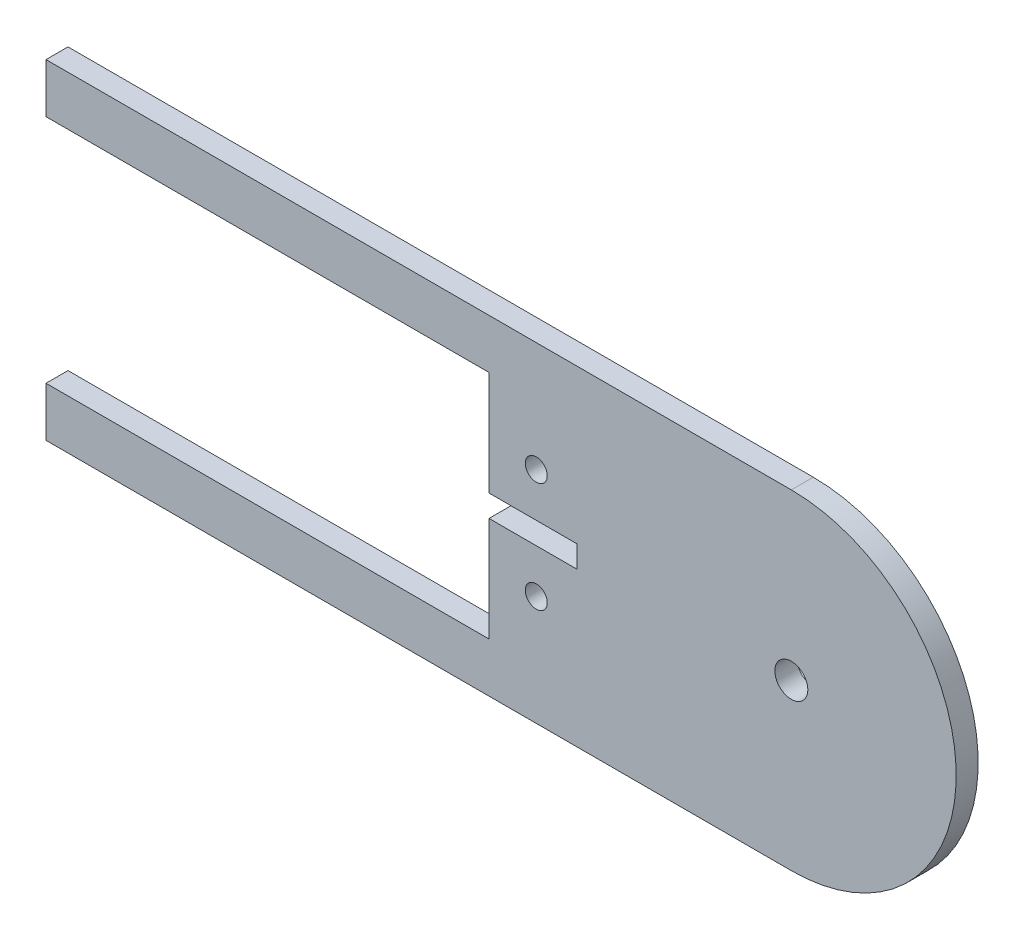
ISO-10303-21;
HEADER;
FILE_DESCRIPTION(('STEP AP214'),'2;1');
FILE_NAME('part.step','',(''),(''),'','','');
FILE_SCHEMA(('AUTOMOTIVE_DESIGN { 1 0 10303 214 1 1 1 1 }'));
ENDSEC;
DATA;
#1=APPLICATION_CONTEXT('core data for automotive mechanical design processes');
#2=APPLICATION_PROTOCOL_DEFINITION('international standard','automotive_design',2000,#1);
#3=PRODUCT_CONTEXT('',#1,'mechanical');
#4=PRODUCT('Part','Part','',(#3));
#5=PRODUCT_RELATED_PRODUCT_CATEGORY('part','',(#4));
#6=PRODUCT_DEFINITION_FORMATION('','',#4);
#7=PRODUCT_DEFINITION_CONTEXT('part definition',#1,'design');
#8=PRODUCT_DEFINITION('design','',#6,#7);
#9=PRODUCT_DEFINITION_SHAPE('','',#8);
#10=(LENGTH_UNIT() NAMED_UNIT(*) SI_UNIT(.MILLI.,.METRE.));
#11=(NAMED_UNIT(*) PLANE_ANGLE_UNIT() SI_UNIT($,.RADIAN.));
#12=(NAMED_UNIT(*) SI_UNIT($,.STERADIAN.) SOLID_ANGLE_UNIT());
#13=UNCERTAINTY_MEASURE_WITH_UNIT(LENGTH_MEASURE(1.E-05),#10,'distance_accuracy_value','');
#14=(GEOMETRIC_REPRESENTATION_CONTEXT(3) GLOBAL_UNCERTAINTY_ASSIGNED_CONTEXT((#13)) GLOBAL_UNIT_ASSIGNED_CONTEXT((#10,
#11,#12)) REPRESENTATION_CONTEXT('',''));
#15=CARTESIAN_POINT('',(0.,0.,0.));
#16=DIRECTION('',(0.,0.,1.));
#17=DIRECTION('',(1.,0.,0.));
#18=AXIS2_PLACEMENT_3D('',#15,#16,#17);
#19=CARTESIAN_POINT('',(0.,30.,-33.));
#20=DIRECTION('',(0.,0.,1.));
#21=DIRECTION('',(1.,0.,0.));
#22=AXIS2_PLACEMENT_3D('',#19,#20,#21);
#23=PLANE('',#22);
#24=CARTESIAN_POINT('',(77.8,15.,-33.));
#25=DIRECTION('',(0.,0.,1.));
#26=DIRECTION('',(1.,0.,0.));
#27=AXIS2_PLACEMENT_3D('',#24,#25,#26);
#28=CIRCLE('',#27,1.5);
#29=CARTESIAN_POINT('',(79.3,15.,-33.));
#30=VERTEX_POINT('',#29);
#31=EDGE_CURVE('E181',#30,#30,#28,.T.);
#32=ORIENTED_EDGE('',*,*,#31,.T.);
#33=EDGE_LOOP('',(#32));
#34=FACE_BOUND('',#33,.T.);
#35=CARTESIAN_POINT('',(54.6,9.99999999999999,-33.));
#36=DIRECTION('',(0.,0.,-1.));
#37=DIRECTION('',(-1.,0.,0.));
#38=AXIS2_PLACEMENT_3D('',#35,#36,#37);
#39=CIRCLE('',#38,1.00000000000001);
#40=CARTESIAN_POINT('',(53.6,9.99999999999999,-33.));
#41=VERTEX_POINT('',#40);
#42=EDGE_CURVE('E176',#41,#41,#39,.T.);
#43=ORIENTED_EDGE('',*,*,#42,.F.);
#44=EDGE_LOOP('',(#43));
#45=FACE_BOUND('',#44,.T.);
#46=CARTESIAN_POINT('',(54.6,20.,-33.));
#47=DIRECTION('',(0.,0.,-1.));
#48=DIRECTION('',(-1.,0.,0.));
#49=AXIS2_PLACEMENT_3D('',#46,#47,#48);
#50=CIRCLE('',#49,0.999999999999998);
#51=CARTESIAN_POINT('',(53.6,20.,-33.));
#52=VERTEX_POINT('',#51);
#53=EDGE_CURVE('E255',#52,#52,#50,.T.);
#54=ORIENTED_EDGE('',*,*,#53,.F.);
#55=EDGE_LOOP('',(#54));
#56=FACE_BOUND('',#55,.T.);
#57=DIRECTION('',(-1.,0.,0.));
#58=VECTOR('',#57,1.);
#59=CARTESIAN_POINT('',(0.,30.,-33.));
#60=LINE('',#59,#58);
#61=CARTESIAN_POINT('',(77.8,30.,-33.));
#62=VERTEX_POINT('',#61);
#63=CARTESIAN_POINT('',(9.99999999999999,30.,-33.));
#64=VERTEX_POINT('',#63);
#65=EDGE_CURVE('E148',#62,#64,#60,.T.);
#66=ORIENTED_EDGE('',*,*,#65,.F.);
#67=CARTESIAN_POINT('',(77.8,15.,-33.));
#68=DIRECTION('',(0.,0.,1.));
#69=DIRECTION('',(-1.,0.,0.));
#70=AXIS2_PLACEMENT_3D('',#67,#68,#69);
#71=CIRCLE('',#70,15.);
#72=CARTESIAN_POINT('',(77.8,0.,-33.));
#73=VERTEX_POINT('',#72);
#74=EDGE_CURVE('E128',#73,#62,#71,.T.);
#75=ORIENTED_EDGE('',*,*,#74,.F.);
#76=DIRECTION('',(-1.,0.,0.));
#77=VECTOR('',#76,1.);
#78=CARTESIAN_POINT('',(0.,0.,-33.));
#79=LINE('',#78,#77);
#80=CARTESIAN_POINT('',(9.99999999999999,0.,-33.));
#81=VERTEX_POINT('',#80);
#82=EDGE_CURVE('E155',#73,#81,#79,.T.);
#83=ORIENTED_EDGE('',*,*,#82,.T.);
#84=DIRECTION('',(0.,-1.,0.));
#85=VECTOR('',#84,1.);
#86=CARTESIAN_POINT('',(9.99999999999999,30.,-33.));
#87=LINE('',#86,#85);
#88=CARTESIAN_POINT('',(10.,4.5,-33.));
#89=VERTEX_POINT('',#88);
#90=EDGE_CURVE('E46',#89,#81,#87,.T.);
#91=ORIENTED_EDGE('',*,*,#90,.F.);
#92=DIRECTION('',(1.,0.,0.));
#93=VECTOR('',#92,1.);
#94=CARTESIAN_POINT('',(0.,4.5,-33.));
#95=LINE('',#94,#93);
#96=CARTESIAN_POINT('',(50.3,4.5,-33.));
#97=VERTEX_POINT('',#96);
#98=EDGE_CURVE('E157',#89,#97,#95,.T.);
#99=ORIENTED_EDGE('',*,*,#98,.T.);
#100=DIRECTION('',(0.,1.,0.));
#101=VECTOR('',#100,1.);
#102=CARTESIAN_POINT('',(50.3,30.,-33.));
#103=LINE('',#102,#101);
#104=CARTESIAN_POINT('',(50.3,14.,-33.));
#105=VERTEX_POINT('',#104);
#106=EDGE_CURVE('E202',#97,#105,#103,.T.);
#107=ORIENTED_EDGE('',*,*,#106,.T.);
#108=DIRECTION('',(1.,0.,0.));
#109=VECTOR('',#108,1.);
#110=CARTESIAN_POINT('',(0.,14.,-33.));
#111=LINE('',#110,#109);
#112=CARTESIAN_POINT('',(58.3,14.,-33.));
#113=VERTEX_POINT('',#112);
#114=EDGE_CURVE('E225',#105,#113,#111,.T.);
#115=ORIENTED_EDGE('',*,*,#114,.T.);
#116=DIRECTION('',(0.,1.,0.));
#117=VECTOR('',#116,1.);
#118=CARTESIAN_POINT('',(58.3,30.,-33.));
#119=LINE('',#118,#117);
#120=CARTESIAN_POINT('',(58.3,16.,-33.));
#121=VERTEX_POINT('',#120);
#122=EDGE_CURVE('E228',#113,#121,#119,.T.);
#123=ORIENTED_EDGE('',*,*,#122,.T.);
#124=DIRECTION('',(-1.,0.,0.));
#125=VECTOR('',#124,1.);
#126=CARTESIAN_POINT('',(0.,16.,-33.));
#127=LINE('',#126,#125);
#128=CARTESIAN_POINT('',(50.3,16.,-33.));
#129=VERTEX_POINT('',#128);
#130=EDGE_CURVE('E226',#121,#129,#127,.T.);
#131=ORIENTED_EDGE('',*,*,#130,.T.);
#132=CARTESIAN_POINT('',(50.3,25.5,-33.));
#133=VERTEX_POINT('',#132);
#134=EDGE_CURVE('E197',#129,#133,#103,.T.);
#135=ORIENTED_EDGE('',*,*,#134,.T.);
#136=DIRECTION('',(-1.,0.,0.));
#137=VECTOR('',#136,1.);
#138=CARTESIAN_POINT('',(0.,25.5,-33.));
#139=LINE('',#138,#137);
#140=CARTESIAN_POINT('',(9.99999999999999,25.5,-33.));
#141=VERTEX_POINT('',#140);
#142=EDGE_CURVE('E194',#133,#141,#139,.T.);
#143=ORIENTED_EDGE('',*,*,#142,.T.);
#144=EDGE_CURVE('E161',#64,#141,#87,.T.);
#145=ORIENTED_EDGE('',*,*,#144,.F.);
#146=EDGE_LOOP('',(#66,#75,#83,#91,#99,#107,#115,#123,#131,#135,#143,#145));
#147=FACE_BOUND('',#146,.T.);
#148=ADVANCED_FACE('F37',(#34,#45,#56,#147),#23,.F.);
#149=CARTESIAN_POINT('',(0.,30.,-31.));
#150=DIRECTION('',(0.,0.,-1.));
#151=DIRECTION('',(-1.,0.,0.));
#152=AXIS2_PLACEMENT_3D('',#149,#150,#151);
#153=PLANE('',#152);
#154=CARTESIAN_POINT('',(77.8,15.,-31.));
#155=DIRECTION('',(0.,0.,-1.));
#156=DIRECTION('',(-1.,0.,0.));
#157=AXIS2_PLACEMENT_3D('',#154,#155,#156);
#158=CIRCLE('',#157,1.5);
#159=CARTESIAN_POINT('',(76.3,15.,-31.));
#160=VERTEX_POINT('',#159);
#161=EDGE_CURVE('E132',#160,#160,#158,.T.);
#162=ORIENTED_EDGE('',*,*,#161,.T.);
#163=EDGE_LOOP('',(#162));
#164=FACE_BOUND('',#163,.T.);
#165=CARTESIAN_POINT('',(54.6,9.99999999999999,-31.));
#166=DIRECTION('',(0.,0.,-1.));
#167=DIRECTION('',(-1.,0.,0.));
#168=AXIS2_PLACEMENT_3D('',#165,#166,#167);
#169=CIRCLE('',#168,1.00000000000001);
#170=CARTESIAN_POINT('',(53.6,9.99999999999999,-31.));
#171=VERTEX_POINT('',#170);
#172=EDGE_CURVE('E175',#171,#171,#169,.T.);
#173=ORIENTED_EDGE('',*,*,#172,.T.);
#174=EDGE_LOOP('',(#173));
#175=FACE_BOUND('',#174,.T.);
#176=CARTESIAN_POINT('',(54.6,20.,-31.));
#177=DIRECTION('',(0.,0.,-1.));
#178=DIRECTION('',(-1.,0.,0.));
#179=AXIS2_PLACEMENT_3D('',#176,#177,#178);
#180=CIRCLE('',#179,0.999999999999998);
#181=CARTESIAN_POINT('',(53.6,20.,-31.));
#182=VERTEX_POINT('',#181);
#183=EDGE_CURVE('E172',#182,#182,#180,.T.);
#184=ORIENTED_EDGE('',*,*,#183,.T.);
#185=EDGE_LOOP('',(#184));
#186=FACE_BOUND('',#185,.T.);
#187=DIRECTION('',(1.,0.,0.));
#188=VECTOR('',#187,1.);
#189=CARTESIAN_POINT('',(0.,0.,-31.));
#190=LINE('',#189,#188);
#191=CARTESIAN_POINT('',(10.,0.,-31.));
#192=VERTEX_POINT('',#191);
#193=CARTESIAN_POINT('',(77.8,0.,-31.));
#194=VERTEX_POINT('',#193);
#195=EDGE_CURVE('E142',#192,#194,#190,.T.);
#196=ORIENTED_EDGE('',*,*,#195,.T.);
#197=CARTESIAN_POINT('',(77.8,15.,-31.));
#198=DIRECTION('',(0.,0.,1.));
#199=DIRECTION('',(-1.,0.,0.));
#200=AXIS2_PLACEMENT_3D('',#197,#198,#199);
#201=CIRCLE('',#200,15.);
#202=CARTESIAN_POINT('',(77.8,30.,-31.));
#203=VERTEX_POINT('',#202);
#204=EDGE_CURVE('E54',#194,#203,#201,.T.);
#205=ORIENTED_EDGE('',*,*,#204,.T.);
#206=DIRECTION('',(1.,0.,0.));
#207=VECTOR('',#206,1.);
#208=CARTESIAN_POINT('',(0.,30.,-31.));
#209=LINE('',#208,#207);
#210=CARTESIAN_POINT('',(10.,30.,-31.));
#211=VERTEX_POINT('',#210);
#212=EDGE_CURVE('E139',#211,#203,#209,.T.);
#213=ORIENTED_EDGE('',*,*,#212,.F.);
#214=DIRECTION('',(0.,-1.,0.));
#215=VECTOR('',#214,1.);
#216=CARTESIAN_POINT('',(10.,30.,-31.));
#217=LINE('',#216,#215);
#218=CARTESIAN_POINT('',(10.,25.5,-31.));
#219=VERTEX_POINT('',#218);
#220=EDGE_CURVE('E150',#211,#219,#217,.T.);
#221=ORIENTED_EDGE('',*,*,#220,.T.);
#222=DIRECTION('',(1.,0.,0.));
#223=VECTOR('',#222,1.);
#224=CARTESIAN_POINT('',(0.,25.5,-31.));
#225=LINE('',#224,#223);
#226=CARTESIAN_POINT('',(50.3,25.5,-31.));
#227=VERTEX_POINT('',#226);
#228=EDGE_CURVE('E159',#219,#227,#225,.T.);
#229=ORIENTED_EDGE('',*,*,#228,.T.);
#230=DIRECTION('',(0.,-1.,0.));
#231=VECTOR('',#230,1.);
#232=CARTESIAN_POINT('',(50.3,30.,-31.));
#233=LINE('',#232,#231);
#234=CARTESIAN_POINT('',(50.3,16.,-31.));
#235=VERTEX_POINT('',#234);
#236=EDGE_CURVE('E165',#227,#235,#233,.T.);
#237=ORIENTED_EDGE('',*,*,#236,.T.);
#238=DIRECTION('',(1.,0.,0.));
#239=VECTOR('',#238,1.);
#240=CARTESIAN_POINT('',(58.3,16.,-31.));
#241=LINE('',#240,#239);
#242=CARTESIAN_POINT('',(58.3,16.,-31.));
#243=VERTEX_POINT('',#242);
#244=EDGE_CURVE('E179',#235,#243,#241,.T.);
#245=ORIENTED_EDGE('',*,*,#244,.T.);
#246=DIRECTION('',(0.,-1.,0.));
#247=VECTOR('',#246,1.);
#248=CARTESIAN_POINT('',(58.3,14.,-31.));
#249=LINE('',#248,#247);
#250=CARTESIAN_POINT('',(58.3,14.,-31.));
#251=VERTEX_POINT('',#250);
#252=EDGE_CURVE('E252',#243,#251,#249,.T.);
#253=ORIENTED_EDGE('',*,*,#252,.T.);
#254=DIRECTION('',(-1.,0.,0.));
#255=VECTOR('',#254,1.);
#256=CARTESIAN_POINT('',(58.3,14.,-31.));
#257=LINE('',#256,#255);
#258=CARTESIAN_POINT('',(50.3,14.,-31.));
#259=VERTEX_POINT('',#258);
#260=EDGE_CURVE('E249',#251,#259,#257,.T.);
#261=ORIENTED_EDGE('',*,*,#260,.T.);
#262=CARTESIAN_POINT('',(50.3,4.5,-31.));
#263=VERTEX_POINT('',#262);
#264=EDGE_CURVE('E164',#259,#263,#233,.T.);
#265=ORIENTED_EDGE('',*,*,#264,.T.);
#266=DIRECTION('',(-1.,0.,0.));
#267=VECTOR('',#266,1.);
#268=CARTESIAN_POINT('',(0.,4.5,-31.));
#269=LINE('',#268,#267);
#270=CARTESIAN_POINT('',(10.,4.5,-31.));
#271=VERTEX_POINT('',#270);
#272=EDGE_CURVE('E168',#263,#271,#269,.T.);
#273=ORIENTED_EDGE('',*,*,#272,.T.);
#274=EDGE_CURVE('E147',#271,#192,#217,.T.);
#275=ORIENTED_EDGE('',*,*,#274,.T.);
#276=EDGE_LOOP('',(#196,#205,#213,#221,#229,#237,#245,#253,#261,#265,#273,#275));
#277=FACE_BOUND('',#276,.T.);
#278=ADVANCED_FACE('F138',(#164,#175,#186,#277),#153,.F.);
#279=CARTESIAN_POINT('',(10.,14.,-33.));
#280=DIRECTION('',(1.,0.,0.));
#281=DIRECTION('',(0.,0.,-1.));
#282=AXIS2_PLACEMENT_3D('',#279,#280,#281);
#283=PLANE('',#282);
#284=ORIENTED_EDGE('',*,*,#274,.F.);
#285=DIRECTION('',(0.,0.,-1.));
#286=VECTOR('',#285,1.);
#287=CARTESIAN_POINT('',(10.,4.5,0.));
#288=LINE('',#287,#286);
#289=EDGE_CURVE('E11',#271,#89,#288,.T.);
#290=ORIENTED_EDGE('',*,*,#289,.T.);
#291=ORIENTED_EDGE('',*,*,#90,.T.);
#292=DIRECTION('',(0.,0.,-1.));
#293=VECTOR('',#292,1.);
#294=CARTESIAN_POINT('',(10.,0.,0.));
#295=LINE('',#294,#293);
#296=EDGE_CURVE('E171',#192,#81,#295,.T.);
#297=ORIENTED_EDGE('',*,*,#296,.F.);
#298=EDGE_LOOP('',(#284,#290,#291,#297));
#299=FACE_BOUND('',#298,.T.);
#300=ADVANCED_FACE('F39',(#299),#283,.F.);
#301=DIRECTION('',(0.,0.,-1.));
#302=VECTOR('',#301,1.);
#303=CARTESIAN_POINT('',(10.,30.,0.));
#304=LINE('',#303,#302);
#305=EDGE_CURVE('E41',#211,#64,#304,.T.);
#306=ORIENTED_EDGE('',*,*,#305,.T.);
#307=ORIENTED_EDGE('',*,*,#144,.T.);
#308=DIRECTION('',(0.,0.,-1.));
#309=VECTOR('',#308,1.);
#310=CARTESIAN_POINT('',(10.,25.5,0.));
#311=LINE('',#310,#309);
#312=EDGE_CURVE('E191',#219,#141,#311,.T.);
#313=ORIENTED_EDGE('',*,*,#312,.F.);
#314=ORIENTED_EDGE('',*,*,#220,.F.);
#315=EDGE_LOOP('',(#306,#307,#313,#314));
#316=FACE_BOUND('',#315,.T.);
#317=ADVANCED_FACE('F190',(#316),#283,.F.);
#318=CARTESIAN_POINT('',(50.3,25.5,0.));
#319=DIRECTION('',(1.,0.,0.));
#320=DIRECTION('',(0.,0.,-1.));
#321=AXIS2_PLACEMENT_3D('',#318,#319,#320);
#322=PLANE('',#321);
#323=ORIENTED_EDGE('',*,*,#264,.F.);
#324=DIRECTION('',(0.,0.,-1.));
#325=VECTOR('',#324,1.);
#326=CARTESIAN_POINT('',(50.3,14.,0.));
#327=LINE('',#326,#325);
#328=EDGE_CURVE('E221',#259,#105,#327,.T.);
#329=ORIENTED_EDGE('',*,*,#328,.T.);
#330=ORIENTED_EDGE('',*,*,#106,.F.);
#331=DIRECTION('',(0.,0.,-1.));
#332=VECTOR('',#331,1.);
#333=CARTESIAN_POINT('',(50.3,4.5,0.));
#334=LINE('',#333,#332);
#335=EDGE_CURVE('E200',#263,#97,#334,.T.);
#336=ORIENTED_EDGE('',*,*,#335,.F.);
#337=EDGE_LOOP('',(#323,#329,#330,#336));
#338=FACE_BOUND('',#337,.T.);
#339=ADVANCED_FACE('F219',(#338),#322,.F.);
#340=CARTESIAN_POINT('',(0.,30.,0.));
#341=DIRECTION('',(0.,1.,0.));
#342=DIRECTION('',(0.,0.,1.));
#343=AXIS2_PLACEMENT_3D('',#340,#341,#342);
#344=PLANE('',#343);
#345=DIRECTION('',(0.,0.,-1.));
#346=VECTOR('',#345,1.);
#347=CARTESIAN_POINT('',(77.8,30.,-31.));
#348=LINE('',#347,#346);
#349=EDGE_CURVE('E125',#203,#62,#348,.T.);
#350=ORIENTED_EDGE('',*,*,#349,.T.);
#351=ORIENTED_EDGE('',*,*,#65,.T.);
#352=ORIENTED_EDGE('',*,*,#305,.F.);
#353=ORIENTED_EDGE('',*,*,#212,.T.);
#354=EDGE_LOOP('',(#350,#351,#352,#353));
#355=FACE_BOUND('',#354,.T.);
#356=ADVANCED_FACE('F145',(#355),#344,.T.);
#357=CARTESIAN_POINT('',(0.,0.,0.));
#358=DIRECTION('',(0.,1.,0.));
#359=DIRECTION('',(0.,0.,1.));
#360=AXIS2_PLACEMENT_3D('',#357,#358,#359);
#361=PLANE('',#360);
#362=ORIENTED_EDGE('',*,*,#82,.F.);
#363=DIRECTION('',(0.,0.,-1.));
#364=VECTOR('',#363,1.);
#365=CARTESIAN_POINT('',(77.8,0.,-31.));
#366=LINE('',#365,#364);
#367=EDGE_CURVE('E133',#194,#73,#366,.T.);
#368=ORIENTED_EDGE('',*,*,#367,.F.);
#369=ORIENTED_EDGE('',*,*,#195,.F.);
#370=ORIENTED_EDGE('',*,*,#296,.T.);
#371=EDGE_LOOP('',(#362,#368,#369,#370));
#372=FACE_BOUND('',#371,.T.);
#373=ADVANCED_FACE('F263',(#372),#361,.F.);
#374=CARTESIAN_POINT('',(10.,4.5,0.));
#375=DIRECTION('',(0.,-1.,0.));
#376=DIRECTION('',(0.,0.,-1.));
#377=AXIS2_PLACEMENT_3D('',#374,#375,#376);
#378=PLANE('',#377);
#379=ORIENTED_EDGE('',*,*,#289,.F.);
#380=ORIENTED_EDGE('',*,*,#272,.F.);
#381=ORIENTED_EDGE('',*,*,#335,.T.);
#382=ORIENTED_EDGE('',*,*,#98,.F.);
#383=EDGE_LOOP('',(#379,#380,#381,#382));
#384=FACE_BOUND('',#383,.T.);
#385=ADVANCED_FACE('F213',(#384),#378,.F.);
#386=ORIENTED_EDGE('',*,*,#134,.F.);
#387=DIRECTION('',(0.,0.,1.));
#388=VECTOR('',#387,1.);
#389=CARTESIAN_POINT('',(50.3,16.,0.));
#390=LINE('',#389,#388);
#391=EDGE_CURVE('E230',#129,#235,#390,.T.);
#392=ORIENTED_EDGE('',*,*,#391,.T.);
#393=ORIENTED_EDGE('',*,*,#236,.F.);
#394=DIRECTION('',(0.,0.,-1.));
#395=VECTOR('',#394,1.);
#396=CARTESIAN_POINT('',(50.3,25.5,0.));
#397=LINE('',#396,#395);
#398=EDGE_CURVE('E205',#227,#133,#397,.T.);
#399=ORIENTED_EDGE('',*,*,#398,.T.);
#400=EDGE_LOOP('',(#386,#392,#393,#399));
#401=FACE_BOUND('',#400,.T.);
#402=ADVANCED_FACE('F241',(#401),#322,.F.);
#403=CARTESIAN_POINT('',(10.,25.5,0.));
#404=DIRECTION('',(0.,1.,0.));
#405=DIRECTION('',(0.,0.,1.));
#406=AXIS2_PLACEMENT_3D('',#403,#404,#405);
#407=PLANE('',#406);
#408=ORIENTED_EDGE('',*,*,#398,.F.);
#409=ORIENTED_EDGE('',*,*,#228,.F.);
#410=ORIENTED_EDGE('',*,*,#312,.T.);
#411=ORIENTED_EDGE('',*,*,#142,.F.);
#412=EDGE_LOOP('',(#408,#409,#410,#411));
#413=FACE_BOUND('',#412,.T.);
#414=ADVANCED_FACE('F237',(#413),#407,.F.);
#415=CARTESIAN_POINT('',(58.3,14.,-31.));
#416=DIRECTION('',(1.,0.,0.));
#417=DIRECTION('',(0.,0.,-1.));
#418=AXIS2_PLACEMENT_3D('',#415,#416,#417);
#419=PLANE('',#418);
#420=DIRECTION('',(0.,0.,-1.));
#421=VECTOR('',#420,1.);
#422=CARTESIAN_POINT('',(58.3,14.,-31.));
#423=LINE('',#422,#421);
#424=EDGE_CURVE('E243',#251,#113,#423,.T.);
#425=ORIENTED_EDGE('',*,*,#424,.F.);
#426=ORIENTED_EDGE('',*,*,#252,.F.);
#427=DIRECTION('',(0.,0.,-1.));
#428=VECTOR('',#427,1.);
#429=CARTESIAN_POINT('',(58.3,16.,-31.));
#430=LINE('',#429,#428);
#431=EDGE_CURVE('E245',#243,#121,#430,.T.);
#432=ORIENTED_EDGE('',*,*,#431,.T.);
#433=ORIENTED_EDGE('',*,*,#122,.F.);
#434=EDGE_LOOP('',(#425,#426,#432,#433));
#435=FACE_BOUND('',#434,.T.);
#436=ADVANCED_FACE('F308',(#435),#419,.F.);
#437=CARTESIAN_POINT('',(58.3,14.,-31.));
#438=DIRECTION('',(0.,-1.,0.));
#439=DIRECTION('',(1.,0.,0.));
#440=AXIS2_PLACEMENT_3D('',#437,#438,#439);
#441=PLANE('',#440);
#442=ORIENTED_EDGE('',*,*,#328,.F.);
#443=ORIENTED_EDGE('',*,*,#260,.F.);
#444=ORIENTED_EDGE('',*,*,#424,.T.);
#445=ORIENTED_EDGE('',*,*,#114,.F.);
#446=EDGE_LOOP('',(#442,#443,#444,#445));
#447=FACE_BOUND('',#446,.T.);
#448=ADVANCED_FACE('F302',(#447),#441,.F.);
#449=CARTESIAN_POINT('',(58.3,16.,-31.));
#450=DIRECTION('',(0.,1.,0.));
#451=DIRECTION('',(-1.,0.,0.));
#452=AXIS2_PLACEMENT_3D('',#449,#450,#451);
#453=PLANE('',#452);
#454=ORIENTED_EDGE('',*,*,#431,.F.);
#455=ORIENTED_EDGE('',*,*,#244,.F.);
#456=ORIENTED_EDGE('',*,*,#391,.F.);
#457=ORIENTED_EDGE('',*,*,#130,.F.);
#458=EDGE_LOOP('',(#454,#455,#456,#457));
#459=FACE_BOUND('',#458,.T.);
#460=ADVANCED_FACE('F291',(#459),#453,.F.);
#461=CARTESIAN_POINT('',(54.6,20.,-29.));
#462=DIRECTION('',(0.,0.,-1.));
#463=DIRECTION('',(-1.,0.,0.));
#464=AXIS2_PLACEMENT_3D('',#461,#462,#463);
#465=CYLINDRICAL_SURFACE('',#464,0.999999999999998);
#466=ORIENTED_EDGE('',*,*,#53,.T.);
#467=EDGE_LOOP('',(#466));
#468=FACE_BOUND('',#467,.T.);
#469=ORIENTED_EDGE('',*,*,#183,.F.);
#470=EDGE_LOOP('',(#469));
#471=FACE_BOUND('',#470,.T.);
#472=ADVANCED_FACE('F287',(#468,#471),#465,.F.);
#473=CARTESIAN_POINT('',(54.6,9.99999999999999,-29.));
#474=DIRECTION('',(0.,0.,-1.));
#475=DIRECTION('',(-1.,0.,0.));
#476=AXIS2_PLACEMENT_3D('',#473,#474,#475);
#477=CYLINDRICAL_SURFACE('',#476,1.00000000000001);
#478=ORIENTED_EDGE('',*,*,#42,.T.);
#479=EDGE_LOOP('',(#478));
#480=FACE_BOUND('',#479,.T.);
#481=ORIENTED_EDGE('',*,*,#172,.F.);
#482=EDGE_LOOP('',(#481));
#483=FACE_BOUND('',#482,.T.);
#484=ADVANCED_FACE('F290',(#480,#483),#477,.F.);
#485=CARTESIAN_POINT('',(77.8,15.,0.));
#486=DIRECTION('',(0.,0.,-1.));
#487=DIRECTION('',(-1.,0.,0.));
#488=AXIS2_PLACEMENT_3D('',#485,#486,#487);
#489=CYLINDRICAL_SURFACE('',#488,1.5);
#490=ORIENTED_EDGE('',*,*,#161,.F.);
#491=EDGE_LOOP('',(#490));
#492=FACE_BOUND('',#491,.T.);
#493=ORIENTED_EDGE('',*,*,#31,.F.);
#494=EDGE_LOOP('',(#493));
#495=FACE_BOUND('',#494,.T.);
#496=ADVANCED_FACE('F299',(#492,#495),#489,.F.);
#497=CARTESIAN_POINT('',(77.8,15.,-31.));
#498=DIRECTION('',(0.,0.,-1.));
#499=DIRECTION('',(-1.,0.,0.));
#500=AXIS2_PLACEMENT_3D('',#497,#498,#499);
#501=CYLINDRICAL_SURFACE('',#500,15.);
#502=ORIENTED_EDGE('',*,*,#74,.T.);
#503=ORIENTED_EDGE('',*,*,#349,.F.);
#504=ORIENTED_EDGE('',*,*,#204,.F.);
#505=ORIENTED_EDGE('',*,*,#367,.T.);
#506=EDGE_LOOP('',(#502,#503,#504,#505));
#507=FACE_BOUND('',#506,.T.);
#508=ADVANCED_FACE('F126',(#507),#501,.T.);
#509=CLOSED_SHELL('',(#148,#278,#300,#317,#339,#356,#373,#385,#402,#414,#436,#448,#460,#472,
#484,#496,#508));
#510=MANIFOLD_SOLID_BREP('B2',#509);
#511=ADVANCED_BREP_SHAPE_REPRESENTATION('',(#18,#510),#14);
#512=SHAPE_DEFINITION_REPRESENTATION(#9,#511);
ENDSEC;
END-ISO-10303-21;
